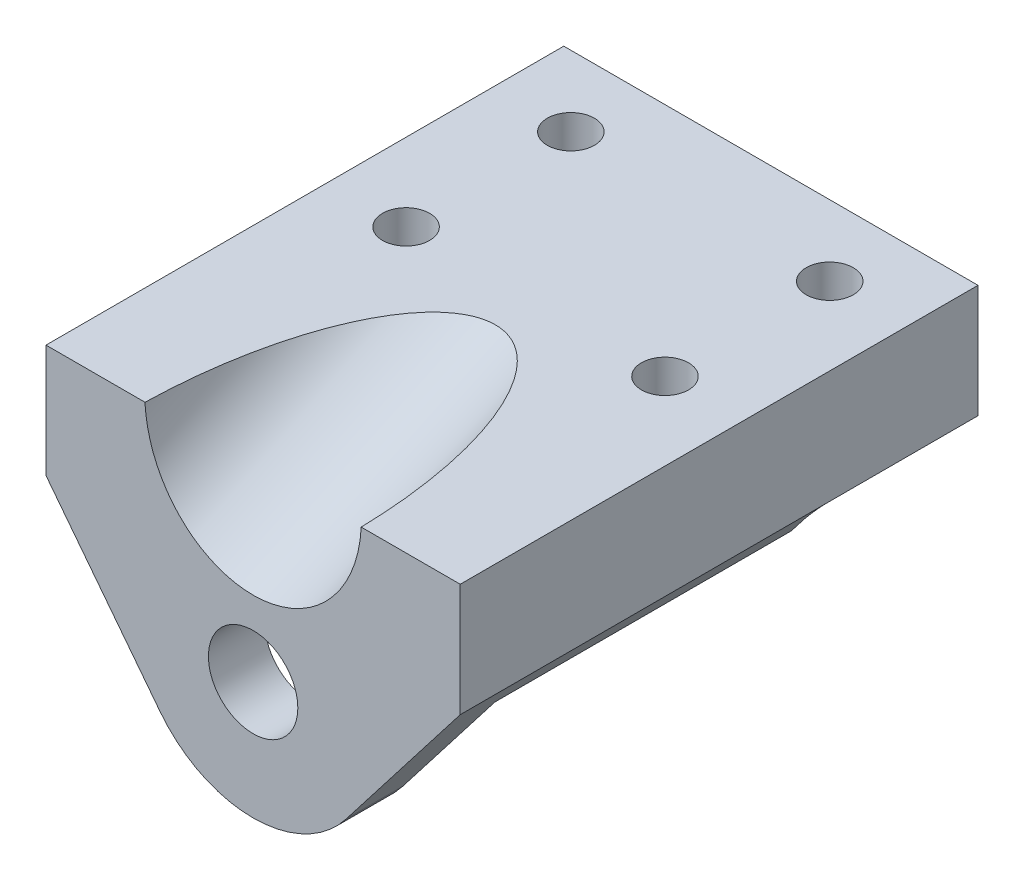
ISO-10303-21;
HEADER;
FILE_DESCRIPTION(('STEP AP214'),'2;1');
FILE_NAME('part.step','',(''),(''),'','','');
FILE_SCHEMA(('AUTOMOTIVE_DESIGN { 1 0 10303 214 1 1 1 1 }'));
ENDSEC;
DATA;
#1=APPLICATION_CONTEXT('core data for automotive mechanical design processes');
#2=APPLICATION_PROTOCOL_DEFINITION('international standard','automotive_design',2000,#1);
#3=PRODUCT_CONTEXT('',#1,'mechanical');
#4=PRODUCT('Part','Part','',(#3));
#5=PRODUCT_RELATED_PRODUCT_CATEGORY('part','',(#4));
#6=PRODUCT_DEFINITION_FORMATION('','',#4);
#7=PRODUCT_DEFINITION_CONTEXT('part definition',#1,'design');
#8=PRODUCT_DEFINITION('design','',#6,#7);
#9=PRODUCT_DEFINITION_SHAPE('','',#8);
#10=(LENGTH_UNIT() NAMED_UNIT(*) SI_UNIT(.MILLI.,.METRE.));
#11=(NAMED_UNIT(*) PLANE_ANGLE_UNIT() SI_UNIT($,.RADIAN.));
#12=(NAMED_UNIT(*) SI_UNIT($,.STERADIAN.) SOLID_ANGLE_UNIT());
#13=UNCERTAINTY_MEASURE_WITH_UNIT(LENGTH_MEASURE(1.E-05),#10,'distance_accuracy_value','');
#14=(GEOMETRIC_REPRESENTATION_CONTEXT(3) GLOBAL_UNCERTAINTY_ASSIGNED_CONTEXT((#13)) GLOBAL_UNIT_ASSIGNED_CONTEXT((#10,
#11,#12)) REPRESENTATION_CONTEXT('',''));
#15=CARTESIAN_POINT('',(0.,0.,0.));
#16=DIRECTION('',(0.,0.,1.));
#17=DIRECTION('',(1.,0.,0.));
#18=AXIS2_PLACEMENT_3D('',#15,#16,#17);
#19=CARTESIAN_POINT('',(-44.,-27.,-78.));
#20=DIRECTION('',(-1.,0.,0.));
#21=DIRECTION('',(0.,0.,1.));
#22=AXIS2_PLACEMENT_3D('',#19,#20,#21);
#23=PLANE('',#22);
#24=DIRECTION('',(0.,0.,-1.));
#25=VECTOR('',#24,1.);
#26=CARTESIAN_POINT('',(-44.,-24.,-78.));
#27=LINE('',#26,#25);
#28=CARTESIAN_POINT('',(-44.,-24.,-78.));
#29=VERTEX_POINT('',#28);
#30=CARTESIAN_POINT('',(-44.,-24.,-110.));
#31=VERTEX_POINT('',#30);
#32=EDGE_CURVE('E223',#29,#31,#27,.T.);
#33=ORIENTED_EDGE('',*,*,#32,.F.);
#34=DIRECTION('',(0.,0.,1.));
#35=VECTOR('',#34,1.);
#36=CARTESIAN_POINT('',(-44.,-24.,-110.001));
#37=LINE('',#36,#35);
#38=CARTESIAN_POINT('',(-44.,-24.,0.));
#39=VERTEX_POINT('',#38);
#40=EDGE_CURVE('E185',#29,#39,#37,.T.);
#41=ORIENTED_EDGE('',*,*,#40,.T.);
#42=DIRECTION('',(0.,-1.,0.));
#43=VECTOR('',#42,1.);
#44=CARTESIAN_POINT('',(-44.,0.,0.));
#45=LINE('',#44,#43);
#46=CARTESIAN_POINT('',(-44.,0.,0.));
#47=VERTEX_POINT('',#46);
#48=EDGE_CURVE('E216',#47,#39,#45,.T.);
#49=ORIENTED_EDGE('',*,*,#48,.F.);
#50=DIRECTION('',(0.,0.,1.));
#51=VECTOR('',#50,1.);
#52=CARTESIAN_POINT('',(-44.,0.,-110.));
#53=LINE('',#52,#51);
#54=CARTESIAN_POINT('',(-44.,0.,-110.));
#55=VERTEX_POINT('',#54);
#56=EDGE_CURVE('E221',#55,#47,#53,.T.);
#57=ORIENTED_EDGE('',*,*,#56,.F.);
#58=DIRECTION('',(0.,1.,0.));
#59=VECTOR('',#58,1.);
#60=CARTESIAN_POINT('',(-44.,-24.,-110.));
#61=LINE('',#60,#59);
#62=EDGE_CURVE('E236',#31,#55,#61,.T.);
#63=ORIENTED_EDGE('',*,*,#62,.F.);
#64=EDGE_LOOP('',(#33,#41,#49,#57,#63));
#65=FACE_BOUND('',#64,.T.);
#66=ADVANCED_FACE('F91',(#65),#23,.T.);
#67=CARTESIAN_POINT('',(44.,-30.,-12.));
#68=DIRECTION('',(0.,1.,0.));
#69=DIRECTION('',(0.,0.,1.));
#70=AXIS2_PLACEMENT_3D('',#67,#68,#69);
#71=PLANE('',#70);
#72=CARTESIAN_POINT('',(-27.4999999999996,-30.,-59.9999999999996));
#73=DIRECTION('',(0.,1.,0.));
#74=DIRECTION('',(0.,0.,1.));
#75=AXIS2_PLACEMENT_3D('',#72,#73,#74);
#76=CIRCLE('',#75,5.);
#77=CARTESIAN_POINT('',(-27.4999999999996,-30.,-54.9999999999996));
#78=VERTEX_POINT('',#77);
#79=EDGE_CURVE('E267',#78,#78,#76,.F.);
#80=ORIENTED_EDGE('',*,*,#79,.F.);
#81=EDGE_LOOP('',(#80));
#82=FACE_BOUND('',#81,.T.);
#83=CARTESIAN_POINT('',(27.5000000000004,-30.,-60.));
#84=DIRECTION('',(0.,1.,0.));
#85=DIRECTION('',(0.,0.,1.));
#86=AXIS2_PLACEMENT_3D('',#83,#84,#85);
#87=CIRCLE('',#86,5.00000000000001);
#88=CARTESIAN_POINT('',(27.5000000000004,-30.,-55.));
#89=VERTEX_POINT('',#88);
#90=EDGE_CURVE('E269',#89,#89,#87,.F.);
#91=ORIENTED_EDGE('',*,*,#90,.F.);
#92=EDGE_LOOP('',(#91));
#93=FACE_BOUND('',#92,.T.);
#94=DIRECTION('',(0.,0.,-1.));
#95=VECTOR('',#94,1.);
#96=CARTESIAN_POINT('',(-39.3555484448053,-30.,-110.001));
#97=LINE('',#96,#95);
#98=CARTESIAN_POINT('',(-39.3555484448053,-30.,-12.));
#99=VERTEX_POINT('',#98);
#100=CARTESIAN_POINT('',(-39.3555484448053,-30.,-75.));
#101=VERTEX_POINT('',#100);
#102=EDGE_CURVE('E194',#99,#101,#97,.T.);
#103=ORIENTED_EDGE('',*,*,#102,.T.);
#104=DIRECTION('',(-1.,0.,0.));
#105=VECTOR('',#104,1.);
#106=CARTESIAN_POINT('',(44.,-30.,-75.));
#107=LINE('',#106,#105);
#108=CARTESIAN_POINT('',(39.3555484448053,-30.,-75.));
#109=VERTEX_POINT('',#108);
#110=EDGE_CURVE('E192',#109,#101,#107,.T.);
#111=ORIENTED_EDGE('',*,*,#110,.F.);
#112=DIRECTION('',(0.,0.,-1.));
#113=VECTOR('',#112,1.);
#114=CARTESIAN_POINT('',(39.3555484448053,-30.,-110.001));
#115=LINE('',#114,#113);
#116=CARTESIAN_POINT('',(39.3555484448053,-30.,-12.));
#117=VERTEX_POINT('',#116);
#118=EDGE_CURVE('E291',#117,#109,#115,.T.);
#119=ORIENTED_EDGE('',*,*,#118,.F.);
#120=DIRECTION('',(-1.,0.,0.));
#121=VECTOR('',#120,1.);
#122=CARTESIAN_POINT('',(44.,-30.,-12.));
#123=LINE('',#122,#121);
#124=EDGE_CURVE('E203',#117,#99,#123,.T.);
#125=ORIENTED_EDGE('',*,*,#124,.T.);
#126=EDGE_LOOP('',(#103,#111,#119,#125));
#127=FACE_BOUND('',#126,.T.);
#128=ADVANCED_FACE('F336',(#82,#93,#127),#71,.F.);
#129=CARTESIAN_POINT('',(44.,-30.,-75.));
#130=DIRECTION('',(0.,0.,1.));
#131=DIRECTION('',(1.,0.,0.));
#132=AXIS2_PLACEMENT_3D('',#129,#130,#131);
#133=PLANE('',#132);
#134=DIRECTION('',(-0.612114706356877,0.790768984129774,0.));
#135=VECTOR('',#134,1.);
#136=CARTESIAN_POINT('',(-39.1308775839133,-30.2902442084566,-75.));
#137=LINE('',#136,#135);
#138=CARTESIAN_POINT('',(-41.6777742224026,-27.,-75.));
#139=VERTEX_POINT('',#138);
#140=EDGE_CURVE('E177',#101,#139,#137,.T.);
#141=ORIENTED_EDGE('',*,*,#140,.T.);
#142=DIRECTION('',(-1.,0.,0.));
#143=VECTOR('',#142,1.);
#144=CARTESIAN_POINT('',(44.,-27.,-75.));
#145=LINE('',#144,#143);
#146=CARTESIAN_POINT('',(41.6777742224026,-27.,-75.));
#147=VERTEX_POINT('',#146);
#148=EDGE_CURVE('E195',#147,#139,#145,.T.);
#149=ORIENTED_EDGE('',*,*,#148,.F.);
#150=DIRECTION('',(0.612114706356877,0.790768984129774,0.));
#151=VECTOR('',#150,1.);
#152=CARTESIAN_POINT('',(39.1308775839133,-30.2902442084566,-75.));
#153=LINE('',#152,#151);
#154=EDGE_CURVE('E107',#109,#147,#153,.T.);
#155=ORIENTED_EDGE('',*,*,#154,.F.);
#156=ORIENTED_EDGE('',*,*,#110,.T.);
#157=EDGE_LOOP('',(#141,#149,#155,#156));
#158=FACE_BOUND('',#157,.T.);
#159=ADVANCED_FACE('F191',(#158),#133,.F.);
#160=CARTESIAN_POINT('',(44.,-27.,-78.));
#161=DIRECTION('',(-1.,0.,0.));
#162=DIRECTION('',(0.,0.,1.));
#163=AXIS2_PLACEMENT_3D('',#160,#161,#162);
#164=CYLINDRICAL_SURFACE('',#163,3.);
#165=CARTESIAN_POINT('',(-41.6777742224027,-27.,-78.));
#166=DIRECTION('',(-0.790768984129774,-0.612114706356877,0.));
#167=DIRECTION('',(-0.612114706356877,0.790768984129774,0.));
#168=AXIS2_PLACEMENT_3D('',#165,#166,#167);
#169=ELLIPSE('',#168,3.79377550233769,3.);
#170=EDGE_CURVE('E172',#139,#29,#169,.T.);
#171=ORIENTED_EDGE('',*,*,#170,.T.);
#172=DIRECTION('',(-1.,0.,0.));
#173=VECTOR('',#172,1.);
#174=CARTESIAN_POINT('',(44.,-24.,-78.));
#175=LINE('',#174,#173);
#176=CARTESIAN_POINT('',(44.,-24.,-78.));
#177=VERTEX_POINT('',#176);
#178=EDGE_CURVE('E200',#177,#29,#175,.T.);
#179=ORIENTED_EDGE('',*,*,#178,.F.);
#180=CARTESIAN_POINT('',(41.6777742224027,-27.,-78.));
#181=DIRECTION('',(-0.790768984129774,0.612114706356877,0.));
#182=DIRECTION('',(-0.612114706356877,-0.790768984129774,0.));
#183=AXIS2_PLACEMENT_3D('',#180,#181,#182);
#184=ELLIPSE('',#183,3.79377550233769,3.);
#185=EDGE_CURVE('E196',#147,#177,#184,.T.);
#186=ORIENTED_EDGE('',*,*,#185,.F.);
#187=ORIENTED_EDGE('',*,*,#148,.T.);
#188=EDGE_LOOP('',(#171,#179,#186,#187));
#189=FACE_BOUND('',#188,.T.);
#190=ADVANCED_FACE('F197',(#189),#164,.F.);
#191=CARTESIAN_POINT('',(44.,-27.,-78.));
#192=DIRECTION('',(-1.,0.,0.));
#193=DIRECTION('',(0.,0.,1.));
#194=AXIS2_PLACEMENT_3D('',#191,#192,#193);
#195=PLANE('',#194);
#196=DIRECTION('',(0.,0.,1.));
#197=VECTOR('',#196,1.);
#198=CARTESIAN_POINT('',(44.,-24.,-110.001));
#199=LINE('',#198,#197);
#200=CARTESIAN_POINT('',(44.,-24.,0.));
#201=VERTEX_POINT('',#200);
#202=EDGE_CURVE('E283',#177,#201,#199,.T.);
#203=ORIENTED_EDGE('',*,*,#202,.F.);
#204=DIRECTION('',(0.,0.,-1.));
#205=VECTOR('',#204,1.);
#206=CARTESIAN_POINT('',(44.,-24.,-78.));
#207=LINE('',#206,#205);
#208=CARTESIAN_POINT('',(44.,-24.,-110.));
#209=VERTEX_POINT('',#208);
#210=EDGE_CURVE('E247',#177,#209,#207,.T.);
#211=ORIENTED_EDGE('',*,*,#210,.T.);
#212=DIRECTION('',(0.,1.,0.));
#213=VECTOR('',#212,1.);
#214=CARTESIAN_POINT('',(44.,-24.,-110.));
#215=LINE('',#214,#213);
#216=CARTESIAN_POINT('',(44.,0.,-110.));
#217=VERTEX_POINT('',#216);
#218=EDGE_CURVE('E232',#209,#217,#215,.T.);
#219=ORIENTED_EDGE('',*,*,#218,.T.);
#220=DIRECTION('',(0.,0.,1.));
#221=VECTOR('',#220,1.);
#222=CARTESIAN_POINT('',(44.,0.,-110.));
#223=LINE('',#222,#221);
#224=CARTESIAN_POINT('',(44.,0.,0.));
#225=VERTEX_POINT('',#224);
#226=EDGE_CURVE('E238',#217,#225,#223,.T.);
#227=ORIENTED_EDGE('',*,*,#226,.T.);
#228=DIRECTION('',(0.,-1.,0.));
#229=VECTOR('',#228,1.);
#230=CARTESIAN_POINT('',(44.,0.,0.));
#231=LINE('',#230,#229);
#232=EDGE_CURVE('E252',#225,#201,#231,.T.);
#233=ORIENTED_EDGE('',*,*,#232,.T.);
#234=EDGE_LOOP('',(#203,#211,#219,#227,#233));
#235=FACE_BOUND('',#234,.T.);
#236=ADVANCED_FACE('F323',(#235),#195,.F.);
#237=CARTESIAN_POINT('',(44.,0.,-110.));
#238=DIRECTION('',(0.,-1.,0.));
#239=DIRECTION('',(0.,0.,-1.));
#240=AXIS2_PLACEMENT_3D('',#237,#238,#239);
#241=PLANE('',#240);
#242=CARTESIAN_POINT('',(27.5000000000004,0.,-60.));
#243=DIRECTION('',(0.,1.,0.));
#244=DIRECTION('',(0.,0.,1.));
#245=AXIS2_PLACEMENT_3D('',#242,#243,#244);
#246=CIRCLE('',#245,5.00000000000001);
#247=CARTESIAN_POINT('',(27.5000000000004,0.,-55.));
#248=VERTEX_POINT('',#247);
#249=EDGE_CURVE('E266',#248,#248,#246,.T.);
#250=ORIENTED_EDGE('',*,*,#249,.F.);
#251=EDGE_LOOP('',(#250));
#252=FACE_BOUND('',#251,.T.);
#253=CARTESIAN_POINT('',(-27.4999999999996,0.,-59.9999999999996));
#254=DIRECTION('',(0.,1.,0.));
#255=DIRECTION('',(0.,0.,1.));
#256=AXIS2_PLACEMENT_3D('',#253,#254,#255);
#257=CIRCLE('',#256,5.);
#258=CARTESIAN_POINT('',(-27.4999999999996,0.,-54.9999999999996));
#259=VERTEX_POINT('',#258);
#260=EDGE_CURVE('E273',#259,#259,#257,.T.);
#261=ORIENTED_EDGE('',*,*,#260,.F.);
#262=EDGE_LOOP('',(#261));
#263=FACE_BOUND('',#262,.T.);
#264=CARTESIAN_POINT('',(-27.5,0.,-94.9999999999996));
#265=DIRECTION('',(0.,1.,0.));
#266=DIRECTION('',(0.,0.,1.));
#267=AXIS2_PLACEMENT_3D('',#264,#265,#266);
#268=CIRCLE('',#267,5.);
#269=CARTESIAN_POINT('',(-27.5,0.,-89.9999999999996));
#270=VERTEX_POINT('',#269);
#271=EDGE_CURVE('E264',#270,#270,#268,.T.);
#272=ORIENTED_EDGE('',*,*,#271,.F.);
#273=EDGE_LOOP('',(#272));
#274=FACE_BOUND('',#273,.T.);
#275=CARTESIAN_POINT('',(27.5,0.,-95.));
#276=DIRECTION('',(0.,1.,0.));
#277=DIRECTION('',(0.,0.,1.));
#278=AXIS2_PLACEMENT_3D('',#275,#276,#277);
#279=CIRCLE('',#278,5.);
#280=CARTESIAN_POINT('',(27.5,0.,-90.));
#281=VERTEX_POINT('',#280);
#282=EDGE_CURVE('E265',#281,#281,#279,.T.);
#283=ORIENTED_EDGE('',*,*,#282,.F.);
#284=EDGE_LOOP('',(#283));
#285=FACE_BOUND('',#284,.T.);
#286=DIRECTION('',(-1.,0.,0.));
#287=VECTOR('',#286,1.);
#288=CARTESIAN_POINT('',(44.,0.,0.));
#289=LINE('',#288,#287);
#290=CARTESIAN_POINT('',(-22.9660829332897,0.,0.));
#291=VERTEX_POINT('',#290);
#292=EDGE_CURVE('E101',#291,#47,#289,.T.);
#293=ORIENTED_EDGE('',*,*,#292,.F.);
#294=CARTESIAN_POINT('',(0.,0.,2.95447032027794));
#295=DIRECTION('',(0.,-1.,0.));
#296=DIRECTION('',(0.,0.,-1.));
#297=AXIS2_PLACEMENT_3D('',#294,#295,#296);
#298=ELLIPSE('',#297,54.4226364125082,23.);
#299=CARTESIAN_POINT('',(22.9660829332897,0.,0.));
#300=VERTEX_POINT('',#299);
#301=EDGE_CURVE('E113',#291,#300,#298,.T.);
#302=ORIENTED_EDGE('',*,*,#301,.T.);
#303=EDGE_CURVE('E12',#225,#300,#289,.T.);
#304=ORIENTED_EDGE('',*,*,#303,.F.);
#305=ORIENTED_EDGE('',*,*,#226,.F.);
#306=DIRECTION('',(-1.,0.,0.));
#307=VECTOR('',#306,1.);
#308=CARTESIAN_POINT('',(44.,0.,-110.));
#309=LINE('',#308,#307);
#310=EDGE_CURVE('E227',#217,#55,#309,.T.);
#311=ORIENTED_EDGE('',*,*,#310,.T.);
#312=ORIENTED_EDGE('',*,*,#56,.T.);
#313=EDGE_LOOP('',(#293,#302,#304,#305,#311,#312));
#314=FACE_BOUND('',#313,.T.);
#315=ADVANCED_FACE('F92',(#252,#263,#274,#285,#314),#241,.F.);
#316=CARTESIAN_POINT('',(44.,0.,0.));
#317=DIRECTION('',(0.,0.,-1.));
#318=DIRECTION('',(0.,1.,0.));
#319=AXIS2_PLACEMENT_3D('',#316,#317,#318);
#320=PLANE('',#319);
#321=CARTESIAN_POINT('',(0.,-40.,0.));
#322=DIRECTION('',(0.,0.,1.));
#323=DIRECTION('',(1.,0.,0.));
#324=AXIS2_PLACEMENT_3D('',#321,#322,#323);
#325=CIRCLE('',#324,9.5);
#326=CARTESIAN_POINT('',(9.5,-40.,0.));
#327=VERTEX_POINT('',#326);
#328=EDGE_CURVE('E302',#327,#327,#325,.T.);
#329=ORIENTED_EDGE('',*,*,#328,.F.);
#330=EDGE_LOOP('',(#329));
#331=FACE_BOUND('',#330,.T.);
#332=DIRECTION('',(0.612114706356877,-0.790768984129774,0.));
#333=VECTOR('',#332,1.);
#334=CARTESIAN_POINT('',(-39.1308775839133,-30.2902442084566,0.));
#335=LINE('',#334,#333);
#336=CARTESIAN_POINT('',(-19.7692246032444,-55.3028676589219,0.));
#337=VERTEX_POINT('',#336);
#338=EDGE_CURVE('E311',#39,#337,#335,.T.);
#339=ORIENTED_EDGE('',*,*,#338,.T.);
#340=CARTESIAN_POINT('',(0.,-40.,0.));
#341=DIRECTION('',(0.,0.,1.));
#342=DIRECTION('',(1.,0.,0.));
#343=AXIS2_PLACEMENT_3D('',#340,#341,#342);
#344=CIRCLE('',#343,25.);
#345=CARTESIAN_POINT('',(19.7692246032444,-55.3028676589219,0.));
#346=VERTEX_POINT('',#345);
#347=EDGE_CURVE('E289',#337,#346,#344,.T.);
#348=ORIENTED_EDGE('',*,*,#347,.T.);
#349=DIRECTION('',(-0.612114706356877,-0.790768984129774,0.));
#350=VECTOR('',#349,1.);
#351=CARTESIAN_POINT('',(39.1308775839133,-30.2902442084566,0.));
#352=LINE('',#351,#350);
#353=EDGE_CURVE('E286',#201,#346,#352,.T.);
#354=ORIENTED_EDGE('',*,*,#353,.F.);
#355=ORIENTED_EDGE('',*,*,#232,.F.);
#356=ORIENTED_EDGE('',*,*,#303,.T.);
#357=CARTESIAN_POINT('',(0.,1.37769213613723,0.));
#358=DIRECTION('',(0.,0.,-1.));
#359=DIRECTION('',(0.,1.,0.));
#360=AXIS2_PLACEMENT_3D('',#357,#358,#359);
#361=ELLIPSE('',#360,25.3776921361372,23.);
#362=EDGE_CURVE('E220',#300,#291,#361,.T.);
#363=ORIENTED_EDGE('',*,*,#362,.T.);
#364=ORIENTED_EDGE('',*,*,#292,.T.);
#365=ORIENTED_EDGE('',*,*,#48,.T.);
#366=EDGE_LOOP('',(#339,#348,#354,#355,#356,#363,#364,#365));
#367=FACE_BOUND('',#366,.T.);
#368=ADVANCED_FACE('F214',(#331,#367),#320,.F.);
#369=CARTESIAN_POINT('',(44.,-65.,-12.));
#370=DIRECTION('',(0.,0.,1.));
#371=DIRECTION('',(1.,0.,0.));
#372=AXIS2_PLACEMENT_3D('',#369,#370,#371);
#373=PLANE('',#372);
#374=CARTESIAN_POINT('',(0.,-40.,-12.));
#375=DIRECTION('',(0.,0.,1.));
#376=DIRECTION('',(1.,0.,0.));
#377=AXIS2_PLACEMENT_3D('',#374,#375,#376);
#378=CIRCLE('',#377,9.5);
#379=CARTESIAN_POINT('',(9.5,-40.,-12.));
#380=VERTEX_POINT('',#379);
#381=EDGE_CURVE('E301',#380,#380,#378,.F.);
#382=ORIENTED_EDGE('',*,*,#381,.F.);
#383=EDGE_LOOP('',(#382));
#384=FACE_BOUND('',#383,.T.);
#385=CARTESIAN_POINT('',(0.,-40.,-12.));
#386=DIRECTION('',(0.,0.,1.));
#387=DIRECTION('',(1.,0.,0.));
#388=AXIS2_PLACEMENT_3D('',#385,#386,#387);
#389=CIRCLE('',#388,25.);
#390=CARTESIAN_POINT('',(19.7692246032444,-55.3028676589219,-12.));
#391=VERTEX_POINT('',#390);
#392=CARTESIAN_POINT('',(-19.7692246032444,-55.3028676589219,-12.));
#393=VERTEX_POINT('',#392);
#394=EDGE_CURVE('E296',#391,#393,#389,.F.);
#395=ORIENTED_EDGE('',*,*,#394,.T.);
#396=DIRECTION('',(-0.612114706356877,0.790768984129774,0.));
#397=VECTOR('',#396,1.);
#398=CARTESIAN_POINT('',(-39.1308775839133,-30.2902442084566,-12.));
#399=LINE('',#398,#397);
#400=EDGE_CURVE('E307',#393,#99,#399,.T.);
#401=ORIENTED_EDGE('',*,*,#400,.T.);
#402=ORIENTED_EDGE('',*,*,#124,.F.);
#403=DIRECTION('',(0.612114706356877,0.790768984129774,0.));
#404=VECTOR('',#403,1.);
#405=CARTESIAN_POINT('',(39.1308775839133,-30.2902442084566,-12.));
#406=LINE('',#405,#404);
#407=EDGE_CURVE('E298',#391,#117,#406,.T.);
#408=ORIENTED_EDGE('',*,*,#407,.F.);
#409=EDGE_LOOP('',(#395,#401,#402,#408));
#410=FACE_BOUND('',#409,.T.);
#411=ADVANCED_FACE('F349',(#384,#410),#373,.F.);
#412=CARTESIAN_POINT('',(44.,-24.,-78.));
#413=DIRECTION('',(0.,1.,0.));
#414=DIRECTION('',(0.,0.,1.));
#415=AXIS2_PLACEMENT_3D('',#412,#413,#414);
#416=PLANE('',#415);
#417=CARTESIAN_POINT('',(-27.5,-24.,-94.9999999999996));
#418=DIRECTION('',(0.,1.,0.));
#419=DIRECTION('',(0.,0.,1.));
#420=AXIS2_PLACEMENT_3D('',#417,#418,#419);
#421=CIRCLE('',#420,5.);
#422=CARTESIAN_POINT('',(-27.5,-24.,-89.9999999999996));
#423=VERTEX_POINT('',#422);
#424=EDGE_CURVE('E280',#423,#423,#421,.F.);
#425=ORIENTED_EDGE('',*,*,#424,.F.);
#426=EDGE_LOOP('',(#425));
#427=FACE_BOUND('',#426,.T.);
#428=CARTESIAN_POINT('',(27.5,-24.,-95.));
#429=DIRECTION('',(0.,1.,0.));
#430=DIRECTION('',(0.,0.,1.));
#431=AXIS2_PLACEMENT_3D('',#428,#429,#430);
#432=CIRCLE('',#431,5.);
#433=CARTESIAN_POINT('',(27.5,-24.,-90.));
#434=VERTEX_POINT('',#433);
#435=EDGE_CURVE('E259',#434,#434,#432,.F.);
#436=ORIENTED_EDGE('',*,*,#435,.F.);
#437=EDGE_LOOP('',(#436));
#438=FACE_BOUND('',#437,.T.);
#439=ORIENTED_EDGE('',*,*,#32,.T.);
#440=DIRECTION('',(-1.,0.,0.));
#441=VECTOR('',#440,1.);
#442=CARTESIAN_POINT('',(44.,-24.,-110.));
#443=LINE('',#442,#441);
#444=EDGE_CURVE('E201',#209,#31,#443,.T.);
#445=ORIENTED_EDGE('',*,*,#444,.F.);
#446=ORIENTED_EDGE('',*,*,#210,.F.);
#447=ORIENTED_EDGE('',*,*,#178,.T.);
#448=EDGE_LOOP('',(#439,#445,#446,#447));
#449=FACE_BOUND('',#448,.T.);
#450=ADVANCED_FACE('F248',(#427,#438,#449),#416,.F.);
#451=CARTESIAN_POINT('',(44.,-24.,-110.));
#452=DIRECTION('',(0.,0.,1.));
#453=DIRECTION('',(1.,0.,0.));
#454=AXIS2_PLACEMENT_3D('',#451,#452,#453);
#455=PLANE('',#454);
#456=ORIENTED_EDGE('',*,*,#62,.T.);
#457=ORIENTED_EDGE('',*,*,#310,.F.);
#458=ORIENTED_EDGE('',*,*,#218,.F.);
#459=ORIENTED_EDGE('',*,*,#444,.T.);
#460=EDGE_LOOP('',(#456,#457,#458,#459));
#461=FACE_BOUND('',#460,.T.);
#462=ADVANCED_FACE('F242',(#461),#455,.F.);
#463=CARTESIAN_POINT('',(0.,-10.4783365279995,25.4253355200013));
#464=DIRECTION('',(0.,0.422618261740694,-0.906307787036653));
#465=DIRECTION('',(0.,0.906307787036653,0.422618261740694));
#466=AXIS2_PLACEMENT_3D('',#463,#464,#465);
#467=CYLINDRICAL_SURFACE('',#466,23.);
#468=ORIENTED_EDGE('',*,*,#362,.F.);
#469=ORIENTED_EDGE('',*,*,#301,.F.);
#470=EDGE_LOOP('',(#468,#469));
#471=FACE_BOUND('',#470,.T.);
#472=ADVANCED_FACE('F350',(#471),#467,.F.);
#473=CARTESIAN_POINT('',(27.5,-65.001,-95.));
#474=DIRECTION('',(0.,1.,0.));
#475=DIRECTION('',(0.,0.,1.));
#476=AXIS2_PLACEMENT_3D('',#473,#474,#475);
#477=CYLINDRICAL_SURFACE('',#476,5.);
#478=ORIENTED_EDGE('',*,*,#282,.T.);
#479=EDGE_LOOP('',(#478));
#480=FACE_BOUND('',#479,.T.);
#481=ORIENTED_EDGE('',*,*,#435,.T.);
#482=EDGE_LOOP('',(#481));
#483=FACE_BOUND('',#482,.T.);
#484=ADVANCED_FACE('F381',(#480,#483),#477,.F.);
#485=CARTESIAN_POINT('',(-27.5,-65.001,-94.9999999999996));
#486=DIRECTION('',(0.,1.,0.));
#487=DIRECTION('',(0.,0.,1.));
#488=AXIS2_PLACEMENT_3D('',#485,#486,#487);
#489=CYLINDRICAL_SURFACE('',#488,5.);
#490=ORIENTED_EDGE('',*,*,#271,.T.);
#491=EDGE_LOOP('',(#490));
#492=FACE_BOUND('',#491,.T.);
#493=ORIENTED_EDGE('',*,*,#424,.T.);
#494=EDGE_LOOP('',(#493));
#495=FACE_BOUND('',#494,.T.);
#496=ADVANCED_FACE('F380',(#492,#495),#489,.F.);
#497=CARTESIAN_POINT('',(-27.4999999999996,-65.001,-59.9999999999996));
#498=DIRECTION('',(0.,1.,0.));
#499=DIRECTION('',(0.,0.,1.));
#500=AXIS2_PLACEMENT_3D('',#497,#498,#499);
#501=CYLINDRICAL_SURFACE('',#500,5.);
#502=ORIENTED_EDGE('',*,*,#260,.T.);
#503=EDGE_LOOP('',(#502));
#504=FACE_BOUND('',#503,.T.);
#505=ORIENTED_EDGE('',*,*,#79,.T.);
#506=EDGE_LOOP('',(#505));
#507=FACE_BOUND('',#506,.T.);
#508=ADVANCED_FACE('F379',(#504,#507),#501,.F.);
#509=CARTESIAN_POINT('',(27.5000000000004,-65.001,-60.));
#510=DIRECTION('',(0.,1.,0.));
#511=DIRECTION('',(0.,0.,1.));
#512=AXIS2_PLACEMENT_3D('',#509,#510,#511);
#513=CYLINDRICAL_SURFACE('',#512,5.00000000000001);
#514=ORIENTED_EDGE('',*,*,#249,.T.);
#515=EDGE_LOOP('',(#514));
#516=FACE_BOUND('',#515,.T.);
#517=ORIENTED_EDGE('',*,*,#90,.T.);
#518=EDGE_LOOP('',(#517));
#519=FACE_BOUND('',#518,.T.);
#520=ADVANCED_FACE('F376',(#516,#519),#513,.F.);
#521=CARTESIAN_POINT('',(0.,-40.,-110.001));
#522=DIRECTION('',(0.,0.,1.));
#523=DIRECTION('',(1.,0.,0.));
#524=AXIS2_PLACEMENT_3D('',#521,#522,#523);
#525=CYLINDRICAL_SURFACE('',#524,25.);
#526=DIRECTION('',(0.,0.,1.));
#527=VECTOR('',#526,1.);
#528=CARTESIAN_POINT('',(19.7692246032444,-55.3028676589219,-110.001));
#529=LINE('',#528,#527);
#530=EDGE_CURVE('E272',#391,#346,#529,.T.);
#531=ORIENTED_EDGE('',*,*,#530,.T.);
#532=ORIENTED_EDGE('',*,*,#347,.F.);
#533=DIRECTION('',(0.,0.,1.));
#534=VECTOR('',#533,1.);
#535=CARTESIAN_POINT('',(-19.7692246032444,-55.3028676589219,-110.001));
#536=LINE('',#535,#534);
#537=EDGE_CURVE('E313',#393,#337,#536,.T.);
#538=ORIENTED_EDGE('',*,*,#537,.F.);
#539=ORIENTED_EDGE('',*,*,#394,.F.);
#540=EDGE_LOOP('',(#531,#532,#538,#539));
#541=FACE_BOUND('',#540,.T.);
#542=ADVANCED_FACE('F319',(#541),#525,.T.);
#543=CARTESIAN_POINT('',(39.1308775839133,-30.2902442084566,-110.001));
#544=DIRECTION('',(-0.790768984129774,0.612114706356877,0.));
#545=DIRECTION('',(-0.612114706356877,-0.790768984129774,0.));
#546=AXIS2_PLACEMENT_3D('',#543,#544,#545);
#547=PLANE('',#546);
#548=ORIENTED_EDGE('',*,*,#407,.T.);
#549=ORIENTED_EDGE('',*,*,#118,.T.);
#550=ORIENTED_EDGE('',*,*,#154,.T.);
#551=ORIENTED_EDGE('',*,*,#185,.T.);
#552=ORIENTED_EDGE('',*,*,#202,.T.);
#553=ORIENTED_EDGE('',*,*,#353,.T.);
#554=ORIENTED_EDGE('',*,*,#530,.F.);
#555=EDGE_LOOP('',(#548,#549,#550,#551,#552,#553,#554));
#556=FACE_BOUND('',#555,.T.);
#557=ADVANCED_FACE('F325',(#556),#547,.F.);
#558=CARTESIAN_POINT('',(-39.1308775839133,-30.2902442084566,-110.001));
#559=DIRECTION('',(-0.790768984129774,-0.612114706356877,0.));
#560=DIRECTION('',(0.612114706356877,-0.790768984129774,0.));
#561=AXIS2_PLACEMENT_3D('',#558,#559,#560);
#562=PLANE('',#561);
#563=ORIENTED_EDGE('',*,*,#537,.T.);
#564=ORIENTED_EDGE('',*,*,#338,.F.);
#565=ORIENTED_EDGE('',*,*,#40,.F.);
#566=ORIENTED_EDGE('',*,*,#170,.F.);
#567=ORIENTED_EDGE('',*,*,#140,.F.);
#568=ORIENTED_EDGE('',*,*,#102,.F.);
#569=ORIENTED_EDGE('',*,*,#400,.F.);
#570=EDGE_LOOP('',(#563,#564,#565,#566,#567,#568,#569));
#571=FACE_BOUND('',#570,.T.);
#572=ADVANCED_FACE('F178',(#571),#562,.T.);
#573=CARTESIAN_POINT('',(0.,-40.,-110.001));
#574=DIRECTION('',(0.,0.,1.));
#575=DIRECTION('',(1.,0.,0.));
#576=AXIS2_PLACEMENT_3D('',#573,#574,#575);
#577=CYLINDRICAL_SURFACE('',#576,9.5);
#578=CARTESIAN_POINT('',(9.5,-40.,0.));
#579=CARTESIAN_POINT('',(9.5,-40.,-0.125));
#580=CARTESIAN_POINT('',(9.5,-40.,-0.25));
#581=CARTESIAN_POINT('',(9.5,-40.,-0.5));
#582=CARTESIAN_POINT('',(9.5,-40.,-0.625000000000001));
#583=CARTESIAN_POINT('',(9.5,-40.,-0.875000000000001));
#584=CARTESIAN_POINT('',(9.5,-40.,-1.));
#585=CARTESIAN_POINT('',(9.5,-40.,-1.25));
#586=CARTESIAN_POINT('',(9.5,-40.,-1.375));
#587=CARTESIAN_POINT('',(9.5,-40.,-1.625));
#588=CARTESIAN_POINT('',(9.5,-40.,-1.75));
#589=CARTESIAN_POINT('',(9.5,-40.,-2.));
#590=CARTESIAN_POINT('',(9.5,-40.,-2.125));
#591=CARTESIAN_POINT('',(9.5,-40.,-2.375));
#592=CARTESIAN_POINT('',(9.5,-40.,-2.5));
#593=CARTESIAN_POINT('',(9.5,-40.,-2.75));
#594=CARTESIAN_POINT('',(9.5,-40.,-2.875));
#595=CARTESIAN_POINT('',(9.5,-40.,-3.125));
#596=CARTESIAN_POINT('',(9.5,-40.,-3.25));
#597=CARTESIAN_POINT('',(9.5,-40.,-3.5));
#598=CARTESIAN_POINT('',(9.5,-40.,-3.625));
#599=CARTESIAN_POINT('',(9.5,-40.,-3.875));
#600=CARTESIAN_POINT('',(9.5,-40.,-4.));
#601=CARTESIAN_POINT('',(9.5,-40.,-4.25));
#602=CARTESIAN_POINT('',(9.5,-40.,-4.375));
#603=CARTESIAN_POINT('',(9.5,-40.,-4.625));
#604=CARTESIAN_POINT('',(9.5,-40.,-4.75));
#605=CARTESIAN_POINT('',(9.5,-40.,-5.));
#606=CARTESIAN_POINT('',(9.5,-40.,-5.125));
#607=CARTESIAN_POINT('',(9.5,-40.,-5.375));
#608=CARTESIAN_POINT('',(9.5,-40.,-5.50000000000001));
#609=CARTESIAN_POINT('',(9.5,-40.,-5.75000000000001));
#610=CARTESIAN_POINT('',(9.5,-40.,-5.87500000000001));
#611=CARTESIAN_POINT('',(9.5,-40.,-6.12500000000001));
#612=CARTESIAN_POINT('',(9.5,-40.,-6.25000000000001));
#613=CARTESIAN_POINT('',(9.5,-40.,-6.50000000000001));
#614=CARTESIAN_POINT('',(9.5,-40.,-6.62500000000001));
#615=CARTESIAN_POINT('',(9.5,-40.,-6.87500000000001));
#616=CARTESIAN_POINT('',(9.5,-40.,-7.00000000000001));
#617=CARTESIAN_POINT('',(9.5,-40.,-7.25000000000001));
#618=CARTESIAN_POINT('',(9.5,-40.,-7.37500000000001));
#619=CARTESIAN_POINT('',(9.5,-40.,-7.62500000000001));
#620=CARTESIAN_POINT('',(9.5,-40.,-7.75000000000001));
#621=CARTESIAN_POINT('',(9.5,-40.,-8.00000000000001));
#622=CARTESIAN_POINT('',(9.5,-40.,-8.12500000000001));
#623=CARTESIAN_POINT('',(9.5,-40.,-8.37500000000001));
#624=CARTESIAN_POINT('',(9.5,-40.,-8.50000000000001));
#625=CARTESIAN_POINT('',(9.5,-40.,-8.75000000000001));
#626=CARTESIAN_POINT('',(9.5,-40.,-8.87500000000001));
#627=CARTESIAN_POINT('',(9.5,-40.,-9.12500000000001));
#628=CARTESIAN_POINT('',(9.5,-40.,-9.25000000000001));
#629=CARTESIAN_POINT('',(9.5,-40.,-9.50000000000001));
#630=CARTESIAN_POINT('',(9.5,-40.,-9.62500000000001));
#631=CARTESIAN_POINT('',(9.5,-40.,-9.87500000000001));
#632=CARTESIAN_POINT('',(9.5,-40.,-10.));
#633=CARTESIAN_POINT('',(9.5,-40.,-10.25));
#634=CARTESIAN_POINT('',(9.5,-40.,-10.375));
#635=CARTESIAN_POINT('',(9.5,-40.,-10.625));
#636=CARTESIAN_POINT('',(9.5,-40.,-10.75));
#637=CARTESIAN_POINT('',(9.5,-40.,-11.));
#638=CARTESIAN_POINT('',(9.5,-40.,-11.125));
#639=CARTESIAN_POINT('',(9.5,-40.,-11.375));
#640=CARTESIAN_POINT('',(9.5,-40.,-11.5));
#641=CARTESIAN_POINT('',(9.5,-40.,-11.75));
#642=CARTESIAN_POINT('',(9.5,-40.,-11.875));
#643=CARTESIAN_POINT('',(9.5,-40.,-12.));
#644=B_SPLINE_CURVE_WITH_KNOTS('',3,(#578,#579,#580,#581,#582,#583,#584,#585,#586,#587,#588,
#589,#590,#591,#592,#593,#594,#595,#596,#597,#598,#599,#600,#601,#602,#603,#604,#605,#606,#607,
#608,#609,#610,#611,#612,#613,#614,#615,#616,#617,#618,#619,#620,#621,#622,#623,#624,#625,#626,
#627,#628,#629,#630,#631,#632,#633,#634,#635,#636,#637,#638,#639,#640,#641,#642,#643),
.UNSPECIFIED.,.F.,.F.,(4,2,2,2,2,2,2,2,2,2,2,2,2,2,2,2,2,2,2,2,2,2,2,2,2,2,2,2,2,2,2,2,4),(0.,
0.375,0.750000000000001,1.125,1.5,1.875,2.25,2.625,3.,3.375,3.75,4.125,4.5,4.875,5.25,
5.62500000000001,6.00000000000001,6.37500000000001,6.75000000000001,7.12500000000001,
7.50000000000001,7.87500000000001,8.25000000000001,8.62500000000001,9.00000000000001,
9.37500000000001,9.75000000000001,10.125,10.5,10.875,11.25,11.625,12.),.UNSPECIFIED.);
#645=EDGE_CURVE('BSEAM363',#327,#380,#644,.T.);
#646=ORIENTED_EDGE('',*,*,#328,.T.);
#647=ORIENTED_EDGE('',*,*,#381,.T.);
#648=ORIENTED_EDGE('',*,*,#645,.T.);
#649=ORIENTED_EDGE('',*,*,#645,.F.);
#650=EDGE_LOOP('',(#646,#648,#647,#649));
#651=FACE_BOUND('',#650,.T.);
#652=ADVANCED_FACE('F363',(#651),#577,.F.);
#653=CLOSED_SHELL('',(#66,#128,#159,#190,#236,#315,#368,#411,#450,#462,#472,#484,#496,#508,#520,
#542,#557,#572,#652));
#654=MANIFOLD_SOLID_BREP('B2',#653);
#655=ADVANCED_BREP_SHAPE_REPRESENTATION('',(#18,#654),#14);
#656=SHAPE_DEFINITION_REPRESENTATION(#9,#655);
ENDSEC;
END-ISO-10303-21;
